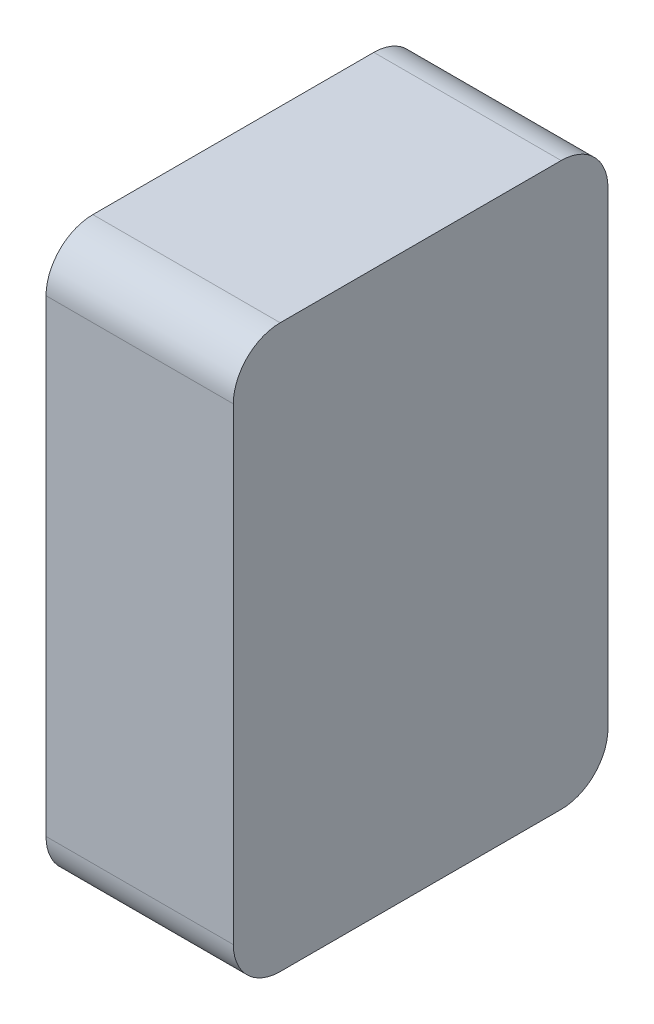
ISO-10303-21;
HEADER;
FILE_DESCRIPTION(('STEP AP214'),'2;1');
FILE_NAME('part.step','',(''),(''),'','','');
FILE_SCHEMA(('AUTOMOTIVE_DESIGN { 1 0 10303 214 1 1 1 1 }'));
ENDSEC;
DATA;
#1=APPLICATION_CONTEXT('core data for automotive mechanical design processes');
#2=APPLICATION_PROTOCOL_DEFINITION('international standard','automotive_design',2000,#1);
#3=PRODUCT_CONTEXT('',#1,'mechanical');
#4=PRODUCT('Part','Part','',(#3));
#5=PRODUCT_RELATED_PRODUCT_CATEGORY('part','',(#4));
#6=PRODUCT_DEFINITION_FORMATION('','',#4);
#7=PRODUCT_DEFINITION_CONTEXT('part definition',#1,'design');
#8=PRODUCT_DEFINITION('design','',#6,#7);
#9=PRODUCT_DEFINITION_SHAPE('','',#8);
#10=(LENGTH_UNIT() NAMED_UNIT(*) SI_UNIT(.MILLI.,.METRE.));
#11=(NAMED_UNIT(*) PLANE_ANGLE_UNIT() SI_UNIT($,.RADIAN.));
#12=(NAMED_UNIT(*) SI_UNIT($,.STERADIAN.) SOLID_ANGLE_UNIT());
#13=UNCERTAINTY_MEASURE_WITH_UNIT(LENGTH_MEASURE(1.E-05),#10,'distance_accuracy_value','');
#14=(GEOMETRIC_REPRESENTATION_CONTEXT(3) GLOBAL_UNCERTAINTY_ASSIGNED_CONTEXT((#13)) GLOBAL_UNIT_ASSIGNED_CONTEXT((#10,
#11,#12)) REPRESENTATION_CONTEXT('',''));
#15=CARTESIAN_POINT('',(0.,0.,0.));
#16=DIRECTION('',(0.,0.,1.));
#17=DIRECTION('',(1.,0.,0.));
#18=AXIS2_PLACEMENT_3D('',#15,#16,#17);
#19=CARTESIAN_POINT('',(60.,-60.,60.));
#20=DIRECTION('',(0.,1.,0.));
#21=DIRECTION('',(0.,0.,1.));
#22=AXIS2_PLACEMENT_3D('',#19,#20,#21);
#23=PLANE('',#22);
#24=DIRECTION('',(0.,0.,-1.));
#25=VECTOR('',#24,1.);
#26=CARTESIAN_POINT('',(60.,-60.,60.));
#27=LINE('',#26,#25);
#28=CARTESIAN_POINT('',(60.,-60.,45.));
#29=VERTEX_POINT('',#28);
#30=CARTESIAN_POINT('',(60.,-60.,-45.));
#31=VERTEX_POINT('',#30);
#32=EDGE_CURVE('E170',#29,#31,#27,.T.);
#33=ORIENTED_EDGE('',*,*,#32,.F.);
#34=DIRECTION('',(-1.,0.,0.));
#35=VECTOR('',#34,1.);
#36=CARTESIAN_POINT('',(60.,-60.,45.));
#37=LINE('',#36,#35);
#38=CARTESIAN_POINT('',(0.,-60.,45.));
#39=VERTEX_POINT('',#38);
#40=EDGE_CURVE('E11',#29,#39,#37,.T.);
#41=ORIENTED_EDGE('',*,*,#40,.T.);
#42=DIRECTION('',(0.,0.,-1.));
#43=VECTOR('',#42,1.);
#44=CARTESIAN_POINT('',(0.,-60.,60.));
#45=LINE('',#44,#43);
#46=CARTESIAN_POINT('',(0.,-60.,-45.));
#47=VERTEX_POINT('',#46);
#48=EDGE_CURVE('E136',#39,#47,#45,.T.);
#49=ORIENTED_EDGE('',*,*,#48,.T.);
#50=DIRECTION('',(-1.,0.,0.));
#51=VECTOR('',#50,1.);
#52=CARTESIAN_POINT('',(60.,-60.,-45.));
#53=LINE('',#52,#51);
#54=EDGE_CURVE('E46',#47,#31,#53,.F.);
#55=ORIENTED_EDGE('',*,*,#54,.T.);
#56=EDGE_LOOP('',(#33,#41,#49,#55));
#57=FACE_BOUND('',#56,.T.);
#58=ADVANCED_FACE('F38',(#57),#23,.F.);
#59=CARTESIAN_POINT('',(60.,120.,-60.));
#60=DIRECTION('',(0.,0.,1.));
#61=DIRECTION('',(1.,0.,0.));
#62=AXIS2_PLACEMENT_3D('',#59,#60,#61);
#63=PLANE('',#62);
#64=DIRECTION('',(0.,1.,0.));
#65=VECTOR('',#64,1.);
#66=CARTESIAN_POINT('',(0.,120.,-60.));
#67=LINE('',#66,#65);
#68=CARTESIAN_POINT('',(0.,-45.,-60.));
#69=VERTEX_POINT('',#68);
#70=CARTESIAN_POINT('',(0.,105.,-60.));
#71=VERTEX_POINT('',#70);
#72=EDGE_CURVE('E131',#69,#71,#67,.T.);
#73=ORIENTED_EDGE('',*,*,#72,.T.);
#74=DIRECTION('',(-1.,0.,0.));
#75=VECTOR('',#74,1.);
#76=CARTESIAN_POINT('',(60.,105.,-60.));
#77=LINE('',#76,#75);
#78=CARTESIAN_POINT('',(60.,105.,-60.));
#79=VERTEX_POINT('',#78);
#80=EDGE_CURVE('E109',#71,#79,#77,.F.);
#81=ORIENTED_EDGE('',*,*,#80,.T.);
#82=DIRECTION('',(0.,1.,0.));
#83=VECTOR('',#82,1.);
#84=CARTESIAN_POINT('',(60.,60.,-60.));
#85=LINE('',#84,#83);
#86=CARTESIAN_POINT('',(60.,-45.,-60.));
#87=VERTEX_POINT('',#86);
#88=EDGE_CURVE('E172',#87,#79,#85,.T.);
#89=ORIENTED_EDGE('',*,*,#88,.F.);
#90=DIRECTION('',(-1.,0.,0.));
#91=VECTOR('',#90,1.);
#92=CARTESIAN_POINT('',(60.,-45.,-60.));
#93=LINE('',#92,#91);
#94=EDGE_CURVE('E114',#87,#69,#93,.T.);
#95=ORIENTED_EDGE('',*,*,#94,.T.);
#96=EDGE_LOOP('',(#73,#81,#89,#95));
#97=FACE_BOUND('',#96,.T.);
#98=ADVANCED_FACE('F204',(#97),#63,.F.);
#99=CARTESIAN_POINT('',(60.,120.,60.));
#100=DIRECTION('',(0.,-1.,0.));
#101=DIRECTION('',(0.,0.,-1.));
#102=AXIS2_PLACEMENT_3D('',#99,#100,#101);
#103=PLANE('',#102);
#104=DIRECTION('',(0.,0.,1.));
#105=VECTOR('',#104,1.);
#106=CARTESIAN_POINT('',(60.,120.,60.));
#107=LINE('',#106,#105);
#108=CARTESIAN_POINT('',(60.,120.,-45.));
#109=VERTEX_POINT('',#108);
#110=CARTESIAN_POINT('',(60.,120.,45.));
#111=VERTEX_POINT('',#110);
#112=EDGE_CURVE('E124',#109,#111,#107,.T.);
#113=ORIENTED_EDGE('',*,*,#112,.F.);
#114=DIRECTION('',(-1.,0.,0.));
#115=VECTOR('',#114,1.);
#116=CARTESIAN_POINT('',(60.,120.,-45.));
#117=LINE('',#116,#115);
#118=CARTESIAN_POINT('',(0.,120.,-45.));
#119=VERTEX_POINT('',#118);
#120=EDGE_CURVE('E108',#109,#119,#117,.T.);
#121=ORIENTED_EDGE('',*,*,#120,.T.);
#122=DIRECTION('',(0.,0.,1.));
#123=VECTOR('',#122,1.);
#124=CARTESIAN_POINT('',(0.,120.,60.));
#125=LINE('',#124,#123);
#126=CARTESIAN_POINT('',(0.,120.,45.));
#127=VERTEX_POINT('',#126);
#128=EDGE_CURVE('E121',#119,#127,#125,.T.);
#129=ORIENTED_EDGE('',*,*,#128,.T.);
#130=DIRECTION('',(-1.,0.,0.));
#131=VECTOR('',#130,1.);
#132=CARTESIAN_POINT('',(60.,120.,45.));
#133=LINE('',#132,#131);
#134=EDGE_CURVE('E126',#127,#111,#133,.F.);
#135=ORIENTED_EDGE('',*,*,#134,.T.);
#136=EDGE_LOOP('',(#113,#121,#129,#135));
#137=FACE_BOUND('',#136,.T.);
#138=ADVANCED_FACE('F120',(#137),#103,.F.);
#139=CARTESIAN_POINT('',(60.,60.,60.));
#140=DIRECTION('',(0.,0.,-1.));
#141=DIRECTION('',(-1.,0.,0.));
#142=AXIS2_PLACEMENT_3D('',#139,#140,#141);
#143=PLANE('',#142);
#144=DIRECTION('',(0.,-1.,0.));
#145=VECTOR('',#144,1.);
#146=CARTESIAN_POINT('',(60.,60.,60.));
#147=LINE('',#146,#145);
#148=CARTESIAN_POINT('',(60.,105.,60.));
#149=VERTEX_POINT('',#148);
#150=CARTESIAN_POINT('',(60.,-45.,60.));
#151=VERTEX_POINT('',#150);
#152=EDGE_CURVE('E134',#149,#151,#147,.T.);
#153=ORIENTED_EDGE('',*,*,#152,.F.);
#154=DIRECTION('',(-1.,0.,0.));
#155=VECTOR('',#154,1.);
#156=CARTESIAN_POINT('',(60.,105.,60.));
#157=LINE('',#156,#155);
#158=CARTESIAN_POINT('',(0.,105.,60.));
#159=VERTEX_POINT('',#158);
#160=EDGE_CURVE('E157',#149,#159,#157,.T.);
#161=ORIENTED_EDGE('',*,*,#160,.T.);
#162=DIRECTION('',(0.,-1.,0.));
#163=VECTOR('',#162,1.);
#164=CARTESIAN_POINT('',(0.,60.,60.));
#165=LINE('',#164,#163);
#166=CARTESIAN_POINT('',(0.,-45.,60.));
#167=VERTEX_POINT('',#166);
#168=EDGE_CURVE('E130',#159,#167,#165,.T.);
#169=ORIENTED_EDGE('',*,*,#168,.T.);
#170=DIRECTION('',(-1.,0.,0.));
#171=VECTOR('',#170,1.);
#172=CARTESIAN_POINT('',(60.,-45.,60.));
#173=LINE('',#172,#171);
#174=EDGE_CURVE('E155',#167,#151,#173,.F.);
#175=ORIENTED_EDGE('',*,*,#174,.T.);
#176=EDGE_LOOP('',(#153,#161,#169,#175));
#177=FACE_BOUND('',#176,.T.);
#178=ADVANCED_FACE('F162',(#177),#143,.F.);
#179=CARTESIAN_POINT('',(60.,0.,0.));
#180=DIRECTION('',(1.,0.,0.));
#181=DIRECTION('',(0.,0.,-1.));
#182=AXIS2_PLACEMENT_3D('',#179,#180,#181);
#183=PLANE('',#182);
#184=ORIENTED_EDGE('',*,*,#88,.T.);
#185=CARTESIAN_POINT('',(60.,105.,-45.));
#186=DIRECTION('',(1.,0.,0.));
#187=DIRECTION('',(0.,0.,-1.));
#188=AXIS2_PLACEMENT_3D('',#185,#186,#187);
#189=CIRCLE('',#188,15.);
#190=EDGE_CURVE('E153',#79,#109,#189,.T.);
#191=ORIENTED_EDGE('',*,*,#190,.T.);
#192=ORIENTED_EDGE('',*,*,#112,.T.);
#193=CARTESIAN_POINT('',(60.,105.,45.));
#194=DIRECTION('',(1.,0.,0.));
#195=DIRECTION('',(0.,0.,-1.));
#196=AXIS2_PLACEMENT_3D('',#193,#194,#195);
#197=CIRCLE('',#196,15.);
#198=EDGE_CURVE('E151',#111,#149,#197,.T.);
#199=ORIENTED_EDGE('',*,*,#198,.T.);
#200=ORIENTED_EDGE('',*,*,#152,.T.);
#201=CARTESIAN_POINT('',(60.,-45.,45.));
#202=DIRECTION('',(1.,0.,0.));
#203=DIRECTION('',(0.,0.,-1.));
#204=AXIS2_PLACEMENT_3D('',#201,#202,#203);
#205=CIRCLE('',#204,15.);
#206=EDGE_CURVE('E59',#151,#29,#205,.T.);
#207=ORIENTED_EDGE('',*,*,#206,.T.);
#208=ORIENTED_EDGE('',*,*,#32,.T.);
#209=CARTESIAN_POINT('',(60.,-45.,-45.));
#210=DIRECTION('',(1.,0.,0.));
#211=DIRECTION('',(0.,0.,-1.));
#212=AXIS2_PLACEMENT_3D('',#209,#210,#211);
#213=CIRCLE('',#212,15.);
#214=EDGE_CURVE('E148',#31,#87,#213,.T.);
#215=ORIENTED_EDGE('',*,*,#214,.T.);
#216=EDGE_LOOP('',(#184,#191,#192,#199,#200,#207,#208,#215));
#217=FACE_BOUND('',#216,.T.);
#218=ADVANCED_FACE('F191',(#217),#183,.T.);
#219=CARTESIAN_POINT('',(0.,0.,0.));
#220=DIRECTION('',(1.,0.,0.));
#221=DIRECTION('',(0.,0.,-1.));
#222=AXIS2_PLACEMENT_3D('',#219,#220,#221);
#223=PLANE('',#222);
#224=CARTESIAN_POINT('',(0.,0.,0.));
#225=DIRECTION('',(-1.,0.,0.));
#226=DIRECTION('',(0.,0.,1.));
#227=AXIS2_PLACEMENT_3D('',#224,#225,#226);
#228=CIRCLE('',#227,45.);
#229=CARTESIAN_POINT('',(0.,0.,45.));
#230=VERTEX_POINT('',#229);
#231=EDGE_CURVE('E181',#230,#230,#228,.T.);
#232=ORIENTED_EDGE('',*,*,#231,.F.);
#233=EDGE_LOOP('',(#232));
#234=FACE_BOUND('',#233,.T.);
#235=ORIENTED_EDGE('',*,*,#128,.F.);
#236=CARTESIAN_POINT('',(0.,105.,-45.));
#237=DIRECTION('',(1.,0.,0.));
#238=DIRECTION('',(0.,0.,-1.));
#239=AXIS2_PLACEMENT_3D('',#236,#237,#238);
#240=CIRCLE('',#239,15.);
#241=EDGE_CURVE('E104',#119,#71,#240,.F.);
#242=ORIENTED_EDGE('',*,*,#241,.T.);
#243=ORIENTED_EDGE('',*,*,#72,.F.);
#244=CARTESIAN_POINT('',(0.,-45.,-45.));
#245=DIRECTION('',(1.,0.,0.));
#246=DIRECTION('',(0.,0.,-1.));
#247=AXIS2_PLACEMENT_3D('',#244,#245,#246);
#248=CIRCLE('',#247,15.);
#249=EDGE_CURVE('E125',#69,#47,#248,.F.);
#250=ORIENTED_EDGE('',*,*,#249,.T.);
#251=ORIENTED_EDGE('',*,*,#48,.F.);
#252=CARTESIAN_POINT('',(0.,-45.,45.));
#253=DIRECTION('',(1.,0.,0.));
#254=DIRECTION('',(0.,0.,-1.));
#255=AXIS2_PLACEMENT_3D('',#252,#253,#254);
#256=CIRCLE('',#255,15.);
#257=EDGE_CURVE('E142',#39,#167,#256,.F.);
#258=ORIENTED_EDGE('',*,*,#257,.T.);
#259=ORIENTED_EDGE('',*,*,#168,.F.);
#260=CARTESIAN_POINT('',(0.,105.,45.));
#261=DIRECTION('',(1.,0.,0.));
#262=DIRECTION('',(0.,0.,-1.));
#263=AXIS2_PLACEMENT_3D('',#260,#261,#262);
#264=CIRCLE('',#263,15.);
#265=EDGE_CURVE('E115',#159,#127,#264,.F.);
#266=ORIENTED_EDGE('',*,*,#265,.T.);
#267=EDGE_LOOP('',(#235,#242,#243,#250,#251,#258,#259,#266));
#268=FACE_BOUND('',#267,.T.);
#269=ADVANCED_FACE('F128',(#234,#268),#223,.F.);
#270=CARTESIAN_POINT('',(40.,0.,0.));
#271=DIRECTION('',(-1.,0.,0.));
#272=DIRECTION('',(0.,0.,1.));
#273=AXIS2_PLACEMENT_3D('',#270,#271,#272);
#274=CYLINDRICAL_SURFACE('',#273,45.);
#275=CARTESIAN_POINT('',(40.,0.,0.));
#276=DIRECTION('',(-1.,0.,0.));
#277=DIRECTION('',(0.,0.,1.));
#278=AXIS2_PLACEMENT_3D('',#275,#276,#277);
#279=CIRCLE('',#278,45.);
#280=CARTESIAN_POINT('',(40.,0.,45.));
#281=VERTEX_POINT('',#280);
#282=EDGE_CURVE('E179',#281,#281,#279,.T.);
#283=ORIENTED_EDGE('',*,*,#282,.F.);
#284=EDGE_LOOP('',(#283));
#285=FACE_BOUND('',#284,.T.);
#286=ORIENTED_EDGE('',*,*,#231,.T.);
#287=EDGE_LOOP('',(#286));
#288=FACE_BOUND('',#287,.T.);
#289=ADVANCED_FACE('F188',(#285,#288),#274,.F.);
#290=CARTESIAN_POINT('',(40.,0.,0.));
#291=DIRECTION('',(-1.,0.,0.));
#292=DIRECTION('',(0.,0.,1.));
#293=AXIS2_PLACEMENT_3D('',#290,#291,#292);
#294=PLANE('',#293);
#295=ORIENTED_EDGE('',*,*,#282,.T.);
#296=EDGE_LOOP('',(#295));
#297=FACE_BOUND('',#296,.T.);
#298=ADVANCED_FACE('F198',(#297),#294,.T.);
#299=CARTESIAN_POINT('',(60.,105.,-45.));
#300=DIRECTION('',(-1.,0.,0.));
#301=DIRECTION('',(0.,0.,1.));
#302=AXIS2_PLACEMENT_3D('',#299,#300,#301);
#303=CYLINDRICAL_SURFACE('',#302,15.);
#304=ORIENTED_EDGE('',*,*,#190,.F.);
#305=ORIENTED_EDGE('',*,*,#80,.F.);
#306=ORIENTED_EDGE('',*,*,#241,.F.);
#307=ORIENTED_EDGE('',*,*,#120,.F.);
#308=EDGE_LOOP('',(#304,#305,#306,#307));
#309=FACE_BOUND('',#308,.T.);
#310=ADVANCED_FACE('F107',(#309),#303,.T.);
#311=CARTESIAN_POINT('',(60.,105.,45.));
#312=DIRECTION('',(-1.,0.,0.));
#313=DIRECTION('',(0.,0.,1.));
#314=AXIS2_PLACEMENT_3D('',#311,#312,#313);
#315=CYLINDRICAL_SURFACE('',#314,15.);
#316=ORIENTED_EDGE('',*,*,#198,.F.);
#317=ORIENTED_EDGE('',*,*,#134,.F.);
#318=ORIENTED_EDGE('',*,*,#265,.F.);
#319=ORIENTED_EDGE('',*,*,#160,.F.);
#320=EDGE_LOOP('',(#316,#317,#318,#319));
#321=FACE_BOUND('',#320,.T.);
#322=ADVANCED_FACE('F215',(#321),#315,.T.);
#323=CARTESIAN_POINT('',(60.,-45.,45.));
#324=DIRECTION('',(-1.,0.,0.));
#325=DIRECTION('',(0.,0.,1.));
#326=AXIS2_PLACEMENT_3D('',#323,#324,#325);
#327=CYLINDRICAL_SURFACE('',#326,15.);
#328=ORIENTED_EDGE('',*,*,#206,.F.);
#329=ORIENTED_EDGE('',*,*,#174,.F.);
#330=ORIENTED_EDGE('',*,*,#257,.F.);
#331=ORIENTED_EDGE('',*,*,#40,.F.);
#332=EDGE_LOOP('',(#328,#329,#330,#331));
#333=FACE_BOUND('',#332,.T.);
#334=ADVANCED_FACE('F169',(#333),#327,.T.);
#335=CARTESIAN_POINT('',(60.,-45.,-45.));
#336=DIRECTION('',(-1.,0.,0.));
#337=DIRECTION('',(0.,0.,1.));
#338=AXIS2_PLACEMENT_3D('',#335,#336,#337);
#339=CYLINDRICAL_SURFACE('',#338,15.);
#340=ORIENTED_EDGE('',*,*,#214,.F.);
#341=ORIENTED_EDGE('',*,*,#54,.F.);
#342=ORIENTED_EDGE('',*,*,#249,.F.);
#343=ORIENTED_EDGE('',*,*,#94,.F.);
#344=EDGE_LOOP('',(#340,#341,#342,#343));
#345=FACE_BOUND('',#344,.T.);
#346=ADVANCED_FACE('F40',(#345),#339,.T.);
#347=CLOSED_SHELL('',(#58,#98,#138,#178,#218,#269,#289,#298,#310,#322,#334,#346));
#348=MANIFOLD_SOLID_BREP('B2',#347);
#349=ADVANCED_BREP_SHAPE_REPRESENTATION('',(#18,#348),#14);
#350=SHAPE_DEFINITION_REPRESENTATION(#9,#349);
ENDSEC;
END-ISO-10303-21;
